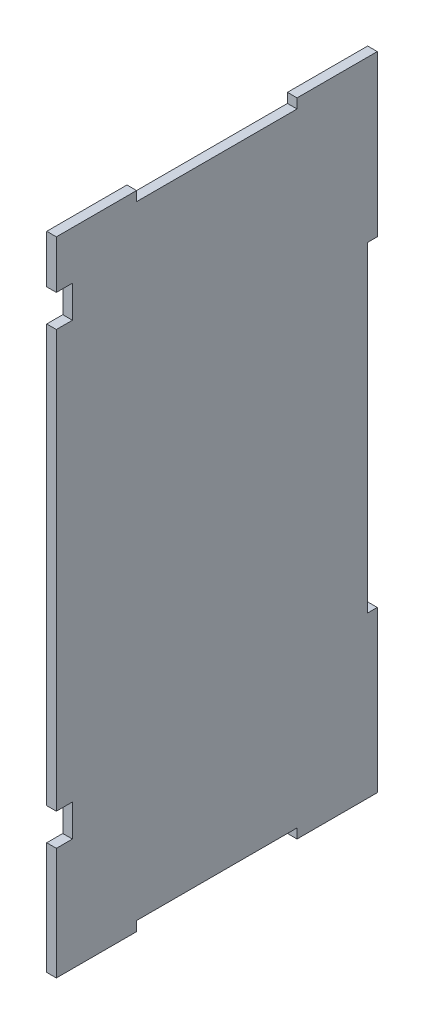
ISO-10303-21;
HEADER;
FILE_DESCRIPTION(('STEP AP214'),'2;1');
FILE_NAME('part.step','',(''),(''),'','','');
FILE_SCHEMA(('AUTOMOTIVE_DESIGN { 1 0 10303 214 1 1 1 1 }'));
ENDSEC;
DATA;
#1=APPLICATION_CONTEXT('core data for automotive mechanical design processes');
#2=APPLICATION_PROTOCOL_DEFINITION('international standard','automotive_design',2000,#1);
#3=PRODUCT_CONTEXT('',#1,'mechanical');
#4=PRODUCT('Part','Part','',(#3));
#5=PRODUCT_RELATED_PRODUCT_CATEGORY('part','',(#4));
#6=PRODUCT_DEFINITION_FORMATION('','',#4);
#7=PRODUCT_DEFINITION_CONTEXT('part definition',#1,'design');
#8=PRODUCT_DEFINITION('design','',#6,#7);
#9=PRODUCT_DEFINITION_SHAPE('','',#8);
#10=(LENGTH_UNIT() NAMED_UNIT(*) SI_UNIT(.MILLI.,.METRE.));
#11=(NAMED_UNIT(*) PLANE_ANGLE_UNIT() SI_UNIT($,.RADIAN.));
#12=(NAMED_UNIT(*) SI_UNIT($,.STERADIAN.) SOLID_ANGLE_UNIT());
#13=UNCERTAINTY_MEASURE_WITH_UNIT(LENGTH_MEASURE(1.E-05),#10,'distance_accuracy_value','');
#14=(GEOMETRIC_REPRESENTATION_CONTEXT(3) GLOBAL_UNCERTAINTY_ASSIGNED_CONTEXT((#13)) GLOBAL_UNIT_ASSIGNED_CONTEXT((#10,
#11,#12)) REPRESENTATION_CONTEXT('',''));
#15=CARTESIAN_POINT('',(0.,0.,0.));
#16=DIRECTION('',(0.,0.,1.));
#17=DIRECTION('',(1.,0.,0.));
#18=AXIS2_PLACEMENT_3D('',#15,#16,#17);
#19=CARTESIAN_POINT('',(-3.00000000000001,-105.653187342477,78.7678487614082));
#20=DIRECTION('',(0.,1.,0.));
#21=DIRECTION('',(0.,0.,1.));
#22=AXIS2_PLACEMENT_3D('',#19,#20,#21);
#23=PLANE('',#22);
#24=DIRECTION('',(0.,0.,1.));
#25=VECTOR('',#24,1.);
#26=CARTESIAN_POINT('',(0.,-105.653187342477,78.7678487614082));
#27=LINE('',#26,#25);
#28=CARTESIAN_POINT('',(0.,-105.653187342477,78.7678487614082));
#29=VERTEX_POINT('',#28);
#30=CARTESIAN_POINT('',(0.,-105.653187342477,103.767848761408));
#31=VERTEX_POINT('',#30);
#32=EDGE_CURVE('E214',#29,#31,#27,.T.);
#33=ORIENTED_EDGE('',*,*,#32,.T.);
#34=DIRECTION('',(1.,0.,0.));
#35=VECTOR('',#34,1.);
#36=CARTESIAN_POINT('',(-3.00000000000001,-105.653187342477,103.767848761408));
#37=LINE('',#36,#35);
#38=CARTESIAN_POINT('',(-3.00000000000001,-105.653187342477,103.767848761408));
#39=VERTEX_POINT('',#38);
#40=EDGE_CURVE('E10',#39,#31,#37,.T.);
#41=ORIENTED_EDGE('',*,*,#40,.F.);
#42=DIRECTION('',(0.,0.,1.));
#43=VECTOR('',#42,1.);
#44=CARTESIAN_POINT('',(-3.00000000000001,-105.653187342477,78.7678487614082));
#45=LINE('',#44,#43);
#46=CARTESIAN_POINT('',(-3.00000000000001,-105.653187342477,78.7678487614082));
#47=VERTEX_POINT('',#46);
#48=EDGE_CURVE('E208',#47,#39,#45,.T.);
#49=ORIENTED_EDGE('',*,*,#48,.F.);
#50=DIRECTION('',(1.,0.,0.));
#51=VECTOR('',#50,1.);
#52=CARTESIAN_POINT('',(-3.00000000000001,-105.653187342477,78.7678487614082));
#53=LINE('',#52,#51);
#54=EDGE_CURVE('E204',#47,#29,#53,.T.);
#55=ORIENTED_EDGE('',*,*,#54,.T.);
#56=EDGE_LOOP('',(#33,#41,#49,#55));
#57=FACE_BOUND('',#56,.T.);
#58=ADVANCED_FACE('F16',(#57),#23,.F.);
#59=CARTESIAN_POINT('',(-3.00000000000001,-105.653187342477,103.767848761408));
#60=DIRECTION('',(0.,0.,-1.));
#61=DIRECTION('',(-1.,0.,0.));
#62=AXIS2_PLACEMENT_3D('',#59,#60,#61);
#63=PLANE('',#62);
#64=DIRECTION('',(0.,1.,0.));
#65=VECTOR('',#64,1.);
#66=CARTESIAN_POINT('',(0.,-105.653187342477,103.767848761408));
#67=LINE('',#66,#65);
#68=CARTESIAN_POINT('',(0.,-70.6531873424773,103.767848761408));
#69=VERTEX_POINT('',#68);
#70=EDGE_CURVE('E210',#31,#69,#67,.T.);
#71=ORIENTED_EDGE('',*,*,#70,.T.);
#72=DIRECTION('',(1.,0.,0.));
#73=VECTOR('',#72,1.);
#74=CARTESIAN_POINT('',(-3.,-70.6531873424773,103.767848761408));
#75=LINE('',#74,#73);
#76=CARTESIAN_POINT('',(-3.,-70.6531873424773,103.767848761408));
#77=VERTEX_POINT('',#76);
#78=EDGE_CURVE('E24',#77,#69,#75,.T.);
#79=ORIENTED_EDGE('',*,*,#78,.F.);
#80=DIRECTION('',(0.,1.,0.));
#81=VECTOR('',#80,1.);
#82=CARTESIAN_POINT('',(-3.00000000000001,-105.653187342477,103.767848761408));
#83=LINE('',#82,#81);
#84=EDGE_CURVE('E123',#39,#77,#83,.T.);
#85=ORIENTED_EDGE('',*,*,#84,.F.);
#86=ORIENTED_EDGE('',*,*,#40,.T.);
#87=EDGE_LOOP('',(#71,#79,#85,#86));
#88=FACE_BOUND('',#87,.T.);
#89=ADVANCED_FACE('F418',(#88),#63,.F.);
#90=CARTESIAN_POINT('',(-3.,-70.6531873424773,103.767848761408));
#91=DIRECTION('',(0.,-1.,0.));
#92=DIRECTION('',(0.,0.,-1.));
#93=AXIS2_PLACEMENT_3D('',#90,#91,#92);
#94=PLANE('',#93);
#95=DIRECTION('',(0.,0.,-1.));
#96=VECTOR('',#95,1.);
#97=CARTESIAN_POINT('',(0.,-70.6531873424773,103.767848761408));
#98=LINE('',#97,#96);
#99=CARTESIAN_POINT('',(0.,-70.6531873424773,98.7678487614082));
#100=VERTEX_POINT('',#99);
#101=EDGE_CURVE('E213',#69,#100,#98,.T.);
#102=ORIENTED_EDGE('',*,*,#101,.T.);
#103=DIRECTION('',(1.,0.,0.));
#104=VECTOR('',#103,1.);
#105=CARTESIAN_POINT('',(-3.,-70.6531873424773,98.7678487614082));
#106=LINE('',#105,#104);
#107=CARTESIAN_POINT('',(-3.,-70.6531873424773,98.7678487614082));
#108=VERTEX_POINT('',#107);
#109=EDGE_CURVE('E334',#108,#100,#106,.T.);
#110=ORIENTED_EDGE('',*,*,#109,.F.);
#111=DIRECTION('',(0.,0.,-1.));
#112=VECTOR('',#111,1.);
#113=CARTESIAN_POINT('',(-3.,-70.6531873424773,103.767848761408));
#114=LINE('',#113,#112);
#115=EDGE_CURVE('E342',#77,#108,#114,.T.);
#116=ORIENTED_EDGE('',*,*,#115,.F.);
#117=ORIENTED_EDGE('',*,*,#78,.T.);
#118=EDGE_LOOP('',(#102,#110,#116,#117));
#119=FACE_BOUND('',#118,.T.);
#120=ADVANCED_FACE('F340',(#119),#94,.F.);
#121=CARTESIAN_POINT('',(-3.,-70.6531873424773,98.7678487614082));
#122=DIRECTION('',(0.,0.,-1.));
#123=DIRECTION('',(-1.,0.,0.));
#124=AXIS2_PLACEMENT_3D('',#121,#122,#123);
#125=PLANE('',#124);
#126=DIRECTION('',(0.,1.,0.));
#127=VECTOR('',#126,1.);
#128=CARTESIAN_POINT('',(0.,-70.6531873424773,98.7678487614082));
#129=LINE('',#128,#127);
#130=CARTESIAN_POINT('',(0.,-60.6531873424772,98.7678487614082));
#131=VERTEX_POINT('',#130);
#132=EDGE_CURVE('E217',#100,#131,#129,.T.);
#133=ORIENTED_EDGE('',*,*,#132,.T.);
#134=DIRECTION('',(1.,0.,0.));
#135=VECTOR('',#134,1.);
#136=CARTESIAN_POINT('',(-3.,-60.6531873424772,98.7678487614082));
#137=LINE('',#136,#135);
#138=CARTESIAN_POINT('',(-3.,-60.6531873424772,98.7678487614082));
#139=VERTEX_POINT('',#138);
#140=EDGE_CURVE('E331',#139,#131,#137,.T.);
#141=ORIENTED_EDGE('',*,*,#140,.F.);
#142=DIRECTION('',(0.,1.,0.));
#143=VECTOR('',#142,1.);
#144=CARTESIAN_POINT('',(-3.,-70.6531873424773,98.7678487614082));
#145=LINE('',#144,#143);
#146=EDGE_CURVE('E360',#108,#139,#145,.T.);
#147=ORIENTED_EDGE('',*,*,#146,.F.);
#148=ORIENTED_EDGE('',*,*,#109,.T.);
#149=EDGE_LOOP('',(#133,#141,#147,#148));
#150=FACE_BOUND('',#149,.T.);
#151=ADVANCED_FACE('F351',(#150),#125,.F.);
#152=CARTESIAN_POINT('',(-3.,-60.6531873424772,98.7678487614082));
#153=DIRECTION('',(0.,1.,0.));
#154=DIRECTION('',(0.,0.,1.));
#155=AXIS2_PLACEMENT_3D('',#152,#153,#154);
#156=PLANE('',#155);
#157=DIRECTION('',(0.,0.,1.));
#158=VECTOR('',#157,1.);
#159=CARTESIAN_POINT('',(0.,-60.6531873424772,98.7678487614082));
#160=LINE('',#159,#158);
#161=CARTESIAN_POINT('',(0.,-60.6531873424772,103.767848761408));
#162=VERTEX_POINT('',#161);
#163=EDGE_CURVE('E220',#131,#162,#160,.T.);
#164=ORIENTED_EDGE('',*,*,#163,.T.);
#165=DIRECTION('',(1.,0.,0.));
#166=VECTOR('',#165,1.);
#167=CARTESIAN_POINT('',(-3.,-60.6531873424772,103.767848761408));
#168=LINE('',#167,#166);
#169=CARTESIAN_POINT('',(-3.,-60.6531873424772,103.767848761408));
#170=VERTEX_POINT('',#169);
#171=EDGE_CURVE('E328',#170,#162,#168,.T.);
#172=ORIENTED_EDGE('',*,*,#171,.F.);
#173=DIRECTION('',(0.,0.,1.));
#174=VECTOR('',#173,1.);
#175=CARTESIAN_POINT('',(-3.,-60.6531873424772,98.7678487614082));
#176=LINE('',#175,#174);
#177=EDGE_CURVE('E357',#139,#170,#176,.T.);
#178=ORIENTED_EDGE('',*,*,#177,.F.);
#179=ORIENTED_EDGE('',*,*,#140,.T.);
#180=EDGE_LOOP('',(#164,#172,#178,#179));
#181=FACE_BOUND('',#180,.T.);
#182=ADVANCED_FACE('F355',(#181),#156,.F.);
#183=CARTESIAN_POINT('',(-3.,-60.6531873424772,103.767848761408));
#184=DIRECTION('',(0.,0.,-1.));
#185=DIRECTION('',(-1.,0.,0.));
#186=AXIS2_PLACEMENT_3D('',#183,#184,#185);
#187=PLANE('',#186);
#188=DIRECTION('',(0.,1.,0.));
#189=VECTOR('',#188,1.);
#190=CARTESIAN_POINT('',(0.,-60.6531873424772,103.767848761408));
#191=LINE('',#190,#189);
#192=CARTESIAN_POINT('',(0.,69.3468126575228,103.767848761408));
#193=VERTEX_POINT('',#192);
#194=EDGE_CURVE('E223',#162,#193,#191,.T.);
#195=ORIENTED_EDGE('',*,*,#194,.T.);
#196=DIRECTION('',(1.,0.,0.));
#197=VECTOR('',#196,1.);
#198=CARTESIAN_POINT('',(-3.,69.3468126575228,103.767848761408));
#199=LINE('',#198,#197);
#200=CARTESIAN_POINT('',(-3.,69.3468126575228,103.767848761408));
#201=VERTEX_POINT('',#200);
#202=EDGE_CURVE('E325',#201,#193,#199,.T.);
#203=ORIENTED_EDGE('',*,*,#202,.F.);
#204=DIRECTION('',(0.,1.,0.));
#205=VECTOR('',#204,1.);
#206=CARTESIAN_POINT('',(-3.,-60.6531873424772,103.767848761408));
#207=LINE('',#206,#205);
#208=EDGE_CURVE('E359',#170,#201,#207,.T.);
#209=ORIENTED_EDGE('',*,*,#208,.F.);
#210=ORIENTED_EDGE('',*,*,#171,.T.);
#211=EDGE_LOOP('',(#195,#203,#209,#210));
#212=FACE_BOUND('',#211,.T.);
#213=ADVANCED_FACE('F431',(#212),#187,.F.);
#214=CARTESIAN_POINT('',(-3.,69.3468126575228,103.767848761408));
#215=DIRECTION('',(0.,-1.,0.));
#216=DIRECTION('',(0.,0.,-1.));
#217=AXIS2_PLACEMENT_3D('',#214,#215,#216);
#218=PLANE('',#217);
#219=DIRECTION('',(0.,0.,-1.));
#220=VECTOR('',#219,1.);
#221=CARTESIAN_POINT('',(0.,69.3468126575228,103.767848761408));
#222=LINE('',#221,#220);
#223=CARTESIAN_POINT('',(0.,69.3468126575228,98.7678487614082));
#224=VERTEX_POINT('',#223);
#225=EDGE_CURVE('E226',#193,#224,#222,.T.);
#226=ORIENTED_EDGE('',*,*,#225,.T.);
#227=DIRECTION('',(1.,0.,0.));
#228=VECTOR('',#227,1.);
#229=CARTESIAN_POINT('',(-3.,69.3468126575228,98.7678487614082));
#230=LINE('',#229,#228);
#231=CARTESIAN_POINT('',(-3.,69.3468126575228,98.7678487614082));
#232=VERTEX_POINT('',#231);
#233=EDGE_CURVE('E322',#232,#224,#230,.T.);
#234=ORIENTED_EDGE('',*,*,#233,.F.);
#235=DIRECTION('',(0.,0.,-1.));
#236=VECTOR('',#235,1.);
#237=CARTESIAN_POINT('',(-3.,69.3468126575228,103.767848761408));
#238=LINE('',#237,#236);
#239=EDGE_CURVE('E362',#201,#232,#238,.T.);
#240=ORIENTED_EDGE('',*,*,#239,.F.);
#241=ORIENTED_EDGE('',*,*,#202,.T.);
#242=EDGE_LOOP('',(#226,#234,#240,#241));
#243=FACE_BOUND('',#242,.T.);
#244=ADVANCED_FACE('F434',(#243),#218,.F.);
#245=CARTESIAN_POINT('',(-3.,69.3468126575228,98.7678487614082));
#246=DIRECTION('',(0.,0.,-1.));
#247=DIRECTION('',(-1.,0.,0.));
#248=AXIS2_PLACEMENT_3D('',#245,#246,#247);
#249=PLANE('',#248);
#250=DIRECTION('',(0.,1.,0.));
#251=VECTOR('',#250,1.);
#252=CARTESIAN_POINT('',(0.,69.3468126575228,98.7678487614082));
#253=LINE('',#252,#251);
#254=CARTESIAN_POINT('',(0.,79.3468126575228,98.7678487614082));
#255=VERTEX_POINT('',#254);
#256=EDGE_CURVE('E229',#224,#255,#253,.T.);
#257=ORIENTED_EDGE('',*,*,#256,.T.);
#258=DIRECTION('',(1.,0.,0.));
#259=VECTOR('',#258,1.);
#260=CARTESIAN_POINT('',(-3.,79.3468126575228,98.7678487614082));
#261=LINE('',#260,#259);
#262=CARTESIAN_POINT('',(-3.,79.3468126575228,98.7678487614082));
#263=VERTEX_POINT('',#262);
#264=EDGE_CURVE('E319',#263,#255,#261,.T.);
#265=ORIENTED_EDGE('',*,*,#264,.F.);
#266=DIRECTION('',(0.,1.,0.));
#267=VECTOR('',#266,1.);
#268=CARTESIAN_POINT('',(-3.,69.3468126575228,98.7678487614082));
#269=LINE('',#268,#267);
#270=EDGE_CURVE('E368',#232,#263,#269,.T.);
#271=ORIENTED_EDGE('',*,*,#270,.F.);
#272=ORIENTED_EDGE('',*,*,#233,.T.);
#273=EDGE_LOOP('',(#257,#265,#271,#272));
#274=FACE_BOUND('',#273,.T.);
#275=ADVANCED_FACE('F438',(#274),#249,.F.);
#276=CARTESIAN_POINT('',(-3.,79.3468126575228,98.7678487614082));
#277=DIRECTION('',(0.,1.,0.));
#278=DIRECTION('',(0.,0.,1.));
#279=AXIS2_PLACEMENT_3D('',#276,#277,#278);
#280=PLANE('',#279);
#281=DIRECTION('',(0.,0.,1.));
#282=VECTOR('',#281,1.);
#283=CARTESIAN_POINT('',(0.,79.3468126575228,98.7678487614082));
#284=LINE('',#283,#282);
#285=CARTESIAN_POINT('',(0.,79.3468126575228,103.767848761408));
#286=VERTEX_POINT('',#285);
#287=EDGE_CURVE('E232',#255,#286,#284,.T.);
#288=ORIENTED_EDGE('',*,*,#287,.T.);
#289=DIRECTION('',(1.,0.,0.));
#290=VECTOR('',#289,1.);
#291=CARTESIAN_POINT('',(-3.,79.3468126575228,103.767848761408));
#292=LINE('',#291,#290);
#293=CARTESIAN_POINT('',(-3.,79.3468126575228,103.767848761408));
#294=VERTEX_POINT('',#293);
#295=EDGE_CURVE('E316',#294,#286,#292,.T.);
#296=ORIENTED_EDGE('',*,*,#295,.F.);
#297=DIRECTION('',(0.,0.,1.));
#298=VECTOR('',#297,1.);
#299=CARTESIAN_POINT('',(-3.,79.3468126575228,98.7678487614082));
#300=LINE('',#299,#298);
#301=EDGE_CURVE('E370',#263,#294,#300,.T.);
#302=ORIENTED_EDGE('',*,*,#301,.F.);
#303=ORIENTED_EDGE('',*,*,#264,.T.);
#304=EDGE_LOOP('',(#288,#296,#302,#303));
#305=FACE_BOUND('',#304,.T.);
#306=ADVANCED_FACE('F442',(#305),#280,.F.);
#307=CARTESIAN_POINT('',(-3.,79.3468126575228,103.767848761408));
#308=DIRECTION('',(0.,0.,-1.));
#309=DIRECTION('',(-1.,0.,0.));
#310=AXIS2_PLACEMENT_3D('',#307,#308,#309);
#311=PLANE('',#310);
#312=DIRECTION('',(0.,1.,0.));
#313=VECTOR('',#312,1.);
#314=CARTESIAN_POINT('',(0.,79.3468126575228,103.767848761408));
#315=LINE('',#314,#313);
#316=CARTESIAN_POINT('',(0.,94.3468126575228,103.767848761408));
#317=VERTEX_POINT('',#316);
#318=EDGE_CURVE('E235',#286,#317,#315,.T.);
#319=ORIENTED_EDGE('',*,*,#318,.T.);
#320=DIRECTION('',(1.,0.,0.));
#321=VECTOR('',#320,1.);
#322=CARTESIAN_POINT('',(-2.99999999999999,94.3468126575228,103.767848761408));
#323=LINE('',#322,#321);
#324=CARTESIAN_POINT('',(-2.99999999999999,94.3468126575228,103.767848761408));
#325=VERTEX_POINT('',#324);
#326=EDGE_CURVE('E313',#325,#317,#323,.T.);
#327=ORIENTED_EDGE('',*,*,#326,.F.);
#328=DIRECTION('',(0.,1.,0.));
#329=VECTOR('',#328,1.);
#330=CARTESIAN_POINT('',(-3.,79.3468126575228,103.767848761408));
#331=LINE('',#330,#329);
#332=EDGE_CURVE('E372',#294,#325,#331,.T.);
#333=ORIENTED_EDGE('',*,*,#332,.F.);
#334=ORIENTED_EDGE('',*,*,#295,.T.);
#335=EDGE_LOOP('',(#319,#327,#333,#334));
#336=FACE_BOUND('',#335,.T.);
#337=ADVANCED_FACE('F446',(#336),#311,.F.);
#338=CARTESIAN_POINT('',(-2.99999999999999,94.3468126575228,103.767848761408));
#339=DIRECTION('',(0.,-1.,0.));
#340=DIRECTION('',(0.,0.,-1.));
#341=AXIS2_PLACEMENT_3D('',#338,#339,#340);
#342=PLANE('',#341);
#343=DIRECTION('',(0.,0.,-1.));
#344=VECTOR('',#343,1.);
#345=CARTESIAN_POINT('',(0.,94.3468126575228,103.767848761408));
#346=LINE('',#345,#344);
#347=CARTESIAN_POINT('',(0.,94.3468126575228,78.7678487614082));
#348=VERTEX_POINT('',#347);
#349=EDGE_CURVE('E238',#317,#348,#346,.T.);
#350=ORIENTED_EDGE('',*,*,#349,.T.);
#351=DIRECTION('',(1.,0.,0.));
#352=VECTOR('',#351,1.);
#353=CARTESIAN_POINT('',(-2.99999999999999,94.3468126575228,78.7678487614082));
#354=LINE('',#353,#352);
#355=CARTESIAN_POINT('',(-2.99999999999999,94.3468126575228,78.7678487614082));
#356=VERTEX_POINT('',#355);
#357=EDGE_CURVE('E310',#356,#348,#354,.T.);
#358=ORIENTED_EDGE('',*,*,#357,.F.);
#359=DIRECTION('',(0.,0.,-1.));
#360=VECTOR('',#359,1.);
#361=CARTESIAN_POINT('',(-2.99999999999999,94.3468126575228,103.767848761408));
#362=LINE('',#361,#360);
#363=EDGE_CURVE('E374',#325,#356,#362,.T.);
#364=ORIENTED_EDGE('',*,*,#363,.F.);
#365=ORIENTED_EDGE('',*,*,#326,.T.);
#366=EDGE_LOOP('',(#350,#358,#364,#365));
#367=FACE_BOUND('',#366,.T.);
#368=ADVANCED_FACE('F450',(#367),#342,.F.);
#369=CARTESIAN_POINT('',(-2.99999999999999,94.3468126575228,78.7678487614082));
#370=DIRECTION('',(0.,0.,1.));
#371=DIRECTION('',(1.,0.,0.));
#372=AXIS2_PLACEMENT_3D('',#369,#370,#371);
#373=PLANE('',#372);
#374=DIRECTION('',(0.,-1.,0.));
#375=VECTOR('',#374,1.);
#376=CARTESIAN_POINT('',(0.,94.3468126575228,78.7678487614082));
#377=LINE('',#376,#375);
#378=CARTESIAN_POINT('',(0.,91.3468126575227,78.7678487614082));
#379=VERTEX_POINT('',#378);
#380=EDGE_CURVE('E241',#348,#379,#377,.T.);
#381=ORIENTED_EDGE('',*,*,#380,.T.);
#382=DIRECTION('',(1.,0.,0.));
#383=VECTOR('',#382,1.);
#384=CARTESIAN_POINT('',(-2.99999999999999,91.3468126575227,78.7678487614082));
#385=LINE('',#384,#383);
#386=CARTESIAN_POINT('',(-2.99999999999999,91.3468126575227,78.7678487614082));
#387=VERTEX_POINT('',#386);
#388=EDGE_CURVE('E307',#387,#379,#385,.T.);
#389=ORIENTED_EDGE('',*,*,#388,.F.);
#390=DIRECTION('',(0.,-1.,0.));
#391=VECTOR('',#390,1.);
#392=CARTESIAN_POINT('',(-2.99999999999999,94.3468126575228,78.7678487614082));
#393=LINE('',#392,#391);
#394=EDGE_CURVE('E376',#356,#387,#393,.T.);
#395=ORIENTED_EDGE('',*,*,#394,.F.);
#396=ORIENTED_EDGE('',*,*,#357,.T.);
#397=EDGE_LOOP('',(#381,#389,#395,#396));
#398=FACE_BOUND('',#397,.T.);
#399=ADVANCED_FACE('F454',(#398),#373,.F.);
#400=CARTESIAN_POINT('',(-2.99999999999999,91.3468126575227,78.7678487614082));
#401=DIRECTION('',(0.,-1.,0.));
#402=DIRECTION('',(0.,0.,-1.));
#403=AXIS2_PLACEMENT_3D('',#400,#401,#402);
#404=PLANE('',#403);
#405=DIRECTION('',(0.,0.,-1.));
#406=VECTOR('',#405,1.);
#407=CARTESIAN_POINT('',(0.,91.3468126575227,78.7678487614082));
#408=LINE('',#407,#406);
#409=CARTESIAN_POINT('',(0.,91.3468126575227,28.7678487614082));
#410=VERTEX_POINT('',#409);
#411=EDGE_CURVE('E244',#379,#410,#408,.T.);
#412=ORIENTED_EDGE('',*,*,#411,.T.);
#413=DIRECTION('',(1.,0.,0.));
#414=VECTOR('',#413,1.);
#415=CARTESIAN_POINT('',(-2.99999999999999,91.3468126575227,28.7678487614082));
#416=LINE('',#415,#414);
#417=CARTESIAN_POINT('',(-2.99999999999999,91.3468126575227,28.7678487614082));
#418=VERTEX_POINT('',#417);
#419=EDGE_CURVE('E304',#418,#410,#416,.T.);
#420=ORIENTED_EDGE('',*,*,#419,.F.);
#421=DIRECTION('',(0.,0.,-1.));
#422=VECTOR('',#421,1.);
#423=CARTESIAN_POINT('',(-2.99999999999999,91.3468126575227,78.7678487614082));
#424=LINE('',#423,#422);
#425=EDGE_CURVE('E378',#387,#418,#424,.T.);
#426=ORIENTED_EDGE('',*,*,#425,.F.);
#427=ORIENTED_EDGE('',*,*,#388,.T.);
#428=EDGE_LOOP('',(#412,#420,#426,#427));
#429=FACE_BOUND('',#428,.T.);
#430=ADVANCED_FACE('F458',(#429),#404,.F.);
#431=CARTESIAN_POINT('',(-2.99999999999999,91.3468126575227,28.7678487614082));
#432=DIRECTION('',(0.,0.,-1.));
#433=DIRECTION('',(-1.,0.,0.));
#434=AXIS2_PLACEMENT_3D('',#431,#432,#433);
#435=PLANE('',#434);
#436=DIRECTION('',(0.,1.,0.));
#437=VECTOR('',#436,1.);
#438=CARTESIAN_POINT('',(0.,91.3468126575227,28.7678487614082));
#439=LINE('',#438,#437);
#440=CARTESIAN_POINT('',(0.,94.3468126575228,28.7678487614082));
#441=VERTEX_POINT('',#440);
#442=EDGE_CURVE('E247',#410,#441,#439,.T.);
#443=ORIENTED_EDGE('',*,*,#442,.T.);
#444=DIRECTION('',(1.,0.,0.));
#445=VECTOR('',#444,1.);
#446=CARTESIAN_POINT('',(-2.99999999999999,94.3468126575228,28.7678487614082));
#447=LINE('',#446,#445);
#448=CARTESIAN_POINT('',(-2.99999999999999,94.3468126575228,28.7678487614082));
#449=VERTEX_POINT('',#448);
#450=EDGE_CURVE('E301',#449,#441,#447,.T.);
#451=ORIENTED_EDGE('',*,*,#450,.F.);
#452=DIRECTION('',(0.,1.,0.));
#453=VECTOR('',#452,1.);
#454=CARTESIAN_POINT('',(-2.99999999999999,91.3468126575227,28.7678487614082));
#455=LINE('',#454,#453);
#456=EDGE_CURVE('E380',#418,#449,#455,.T.);
#457=ORIENTED_EDGE('',*,*,#456,.F.);
#458=ORIENTED_EDGE('',*,*,#419,.T.);
#459=EDGE_LOOP('',(#443,#451,#457,#458));
#460=FACE_BOUND('',#459,.T.);
#461=ADVANCED_FACE('F462',(#460),#435,.F.);
#462=CARTESIAN_POINT('',(-2.99999999999999,94.3468126575228,28.7678487614082));
#463=DIRECTION('',(0.,-1.,0.));
#464=DIRECTION('',(0.,0.,-1.));
#465=AXIS2_PLACEMENT_3D('',#462,#463,#464);
#466=PLANE('',#465);
#467=DIRECTION('',(0.,0.,-1.));
#468=VECTOR('',#467,1.);
#469=CARTESIAN_POINT('',(0.,94.3468126575228,28.7678487614082));
#470=LINE('',#469,#468);
#471=CARTESIAN_POINT('',(0.,94.3468126575228,3.76784876140819));
#472=VERTEX_POINT('',#471);
#473=EDGE_CURVE('E250',#441,#472,#470,.T.);
#474=ORIENTED_EDGE('',*,*,#473,.T.);
#475=DIRECTION('',(1.,0.,0.));
#476=VECTOR('',#475,1.);
#477=CARTESIAN_POINT('',(-2.99999999999999,94.3468126575228,3.76784876140819));
#478=LINE('',#477,#476);
#479=CARTESIAN_POINT('',(-2.99999999999999,94.3468126575228,3.76784876140819));
#480=VERTEX_POINT('',#479);
#481=EDGE_CURVE('E298',#480,#472,#478,.T.);
#482=ORIENTED_EDGE('',*,*,#481,.F.);
#483=DIRECTION('',(0.,0.,-1.));
#484=VECTOR('',#483,1.);
#485=CARTESIAN_POINT('',(-2.99999999999999,94.3468126575228,28.7678487614082));
#486=LINE('',#485,#484);
#487=EDGE_CURVE('E382',#449,#480,#486,.T.);
#488=ORIENTED_EDGE('',*,*,#487,.F.);
#489=ORIENTED_EDGE('',*,*,#450,.T.);
#490=EDGE_LOOP('',(#474,#482,#488,#489));
#491=FACE_BOUND('',#490,.T.);
#492=ADVANCED_FACE('F466',(#491),#466,.F.);
#493=CARTESIAN_POINT('',(-2.99999999999999,94.3468126575228,3.76784876140819));
#494=DIRECTION('',(0.,0.,1.));
#495=DIRECTION('',(0.,-1.,0.));
#496=AXIS2_PLACEMENT_3D('',#493,#494,#495);
#497=PLANE('',#496);
#498=DIRECTION('',(0.,-1.,0.));
#499=VECTOR('',#498,1.);
#500=CARTESIAN_POINT('',(0.,94.3468126575228,3.76784876140819));
#501=LINE('',#500,#499);
#502=CARTESIAN_POINT('',(0.,44.3468126575228,3.76784876140819));
#503=VERTEX_POINT('',#502);
#504=EDGE_CURVE('E253',#472,#503,#501,.T.);
#505=ORIENTED_EDGE('',*,*,#504,.T.);
#506=DIRECTION('',(1.,0.,0.));
#507=VECTOR('',#506,1.);
#508=CARTESIAN_POINT('',(-3.,44.3468126575228,3.76784876140819));
#509=LINE('',#508,#507);
#510=CARTESIAN_POINT('',(-3.,44.3468126575228,3.76784876140819));
#511=VERTEX_POINT('',#510);
#512=EDGE_CURVE('E295',#511,#503,#509,.T.);
#513=ORIENTED_EDGE('',*,*,#512,.F.);
#514=DIRECTION('',(0.,-1.,0.));
#515=VECTOR('',#514,1.);
#516=CARTESIAN_POINT('',(-2.99999999999999,94.3468126575228,3.76784876140819));
#517=LINE('',#516,#515);
#518=EDGE_CURVE('E384',#480,#511,#517,.T.);
#519=ORIENTED_EDGE('',*,*,#518,.F.);
#520=ORIENTED_EDGE('',*,*,#481,.T.);
#521=EDGE_LOOP('',(#505,#513,#519,#520));
#522=FACE_BOUND('',#521,.T.);
#523=ADVANCED_FACE('F470',(#522),#497,.F.);
#524=CARTESIAN_POINT('',(-3.,44.3468126575228,3.76784876140819));
#525=DIRECTION('',(0.,1.,0.));
#526=DIRECTION('',(0.,0.,1.));
#527=AXIS2_PLACEMENT_3D('',#524,#525,#526);
#528=PLANE('',#527);
#529=DIRECTION('',(0.,0.,1.));
#530=VECTOR('',#529,1.);
#531=CARTESIAN_POINT('',(0.,44.3468126575228,3.76784876140819));
#532=LINE('',#531,#530);
#533=CARTESIAN_POINT('',(0.,44.3468126575228,6.7678487614082));
#534=VERTEX_POINT('',#533);
#535=EDGE_CURVE('E256',#503,#534,#532,.T.);
#536=ORIENTED_EDGE('',*,*,#535,.T.);
#537=DIRECTION('',(1.,0.,0.));
#538=VECTOR('',#537,1.);
#539=CARTESIAN_POINT('',(-3.,44.3468126575228,6.7678487614082));
#540=LINE('',#539,#538);
#541=CARTESIAN_POINT('',(-3.,44.3468126575228,6.7678487614082));
#542=VERTEX_POINT('',#541);
#543=EDGE_CURVE('E292',#542,#534,#540,.T.);
#544=ORIENTED_EDGE('',*,*,#543,.F.);
#545=DIRECTION('',(0.,0.,1.));
#546=VECTOR('',#545,1.);
#547=CARTESIAN_POINT('',(-3.,44.3468126575228,3.76784876140819));
#548=LINE('',#547,#546);
#549=EDGE_CURVE('E386',#511,#542,#548,.T.);
#550=ORIENTED_EDGE('',*,*,#549,.F.);
#551=ORIENTED_EDGE('',*,*,#512,.T.);
#552=EDGE_LOOP('',(#536,#544,#550,#551));
#553=FACE_BOUND('',#552,.T.);
#554=ADVANCED_FACE('F474',(#553),#528,.F.);
#555=CARTESIAN_POINT('',(-3.,44.3468126575228,6.7678487614082));
#556=DIRECTION('',(0.,0.,1.));
#557=DIRECTION('',(0.,-1.,0.));
#558=AXIS2_PLACEMENT_3D('',#555,#556,#557);
#559=PLANE('',#558);
#560=DIRECTION('',(0.,-1.,0.));
#561=VECTOR('',#560,1.);
#562=CARTESIAN_POINT('',(0.,44.3468126575228,6.7678487614082));
#563=LINE('',#562,#561);
#564=CARTESIAN_POINT('',(0.,-55.6531873424772,6.76784876140819));
#565=VERTEX_POINT('',#564);
#566=EDGE_CURVE('E259',#534,#565,#563,.T.);
#567=ORIENTED_EDGE('',*,*,#566,.T.);
#568=DIRECTION('',(1.,0.,0.));
#569=VECTOR('',#568,1.);
#570=CARTESIAN_POINT('',(-3.,-55.6531873424772,6.76784876140819));
#571=LINE('',#570,#569);
#572=CARTESIAN_POINT('',(-3.,-55.6531873424772,6.76784876140819));
#573=VERTEX_POINT('',#572);
#574=EDGE_CURVE('E289',#573,#565,#571,.T.);
#575=ORIENTED_EDGE('',*,*,#574,.F.);
#576=DIRECTION('',(0.,-1.,0.));
#577=VECTOR('',#576,1.);
#578=CARTESIAN_POINT('',(-3.,44.3468126575228,6.7678487614082));
#579=LINE('',#578,#577);
#580=EDGE_CURVE('E388',#542,#573,#579,.T.);
#581=ORIENTED_EDGE('',*,*,#580,.F.);
#582=ORIENTED_EDGE('',*,*,#543,.T.);
#583=EDGE_LOOP('',(#567,#575,#581,#582));
#584=FACE_BOUND('',#583,.T.);
#585=ADVANCED_FACE('F478',(#584),#559,.F.);
#586=CARTESIAN_POINT('',(-3.,-55.6531873424772,6.76784876140819));
#587=DIRECTION('',(0.,-1.,0.));
#588=DIRECTION('',(0.,0.,-1.));
#589=AXIS2_PLACEMENT_3D('',#586,#587,#588);
#590=PLANE('',#589);
#591=DIRECTION('',(0.,0.,-1.));
#592=VECTOR('',#591,1.);
#593=CARTESIAN_POINT('',(0.,-55.6531873424772,6.76784876140819));
#594=LINE('',#593,#592);
#595=CARTESIAN_POINT('',(0.,-55.6531873424772,3.76784876140819));
#596=VERTEX_POINT('',#595);
#597=EDGE_CURVE('E262',#565,#596,#594,.T.);
#598=ORIENTED_EDGE('',*,*,#597,.T.);
#599=DIRECTION('',(1.,0.,0.));
#600=VECTOR('',#599,1.);
#601=CARTESIAN_POINT('',(-3.,-55.6531873424772,3.76784876140819));
#602=LINE('',#601,#600);
#603=CARTESIAN_POINT('',(-3.,-55.6531873424772,3.76784876140819));
#604=VERTEX_POINT('',#603);
#605=EDGE_CURVE('E286',#604,#596,#602,.T.);
#606=ORIENTED_EDGE('',*,*,#605,.F.);
#607=DIRECTION('',(0.,0.,-1.));
#608=VECTOR('',#607,1.);
#609=CARTESIAN_POINT('',(-3.,-55.6531873424772,6.76784876140819));
#610=LINE('',#609,#608);
#611=EDGE_CURVE('E390',#573,#604,#610,.T.);
#612=ORIENTED_EDGE('',*,*,#611,.F.);
#613=ORIENTED_EDGE('',*,*,#574,.T.);
#614=EDGE_LOOP('',(#598,#606,#612,#613));
#615=FACE_BOUND('',#614,.T.);
#616=ADVANCED_FACE('F482',(#615),#590,.F.);
#617=CARTESIAN_POINT('',(-3.,-55.6531873424772,3.76784876140819));
#618=DIRECTION('',(0.,0.,1.));
#619=DIRECTION('',(1.,0.,0.));
#620=AXIS2_PLACEMENT_3D('',#617,#618,#619);
#621=PLANE('',#620);
#622=DIRECTION('',(0.,-1.,0.));
#623=VECTOR('',#622,1.);
#624=CARTESIAN_POINT('',(0.,-55.6531873424772,3.76784876140819));
#625=LINE('',#624,#623);
#626=CARTESIAN_POINT('',(0.,-105.653187342477,3.76784876140819));
#627=VERTEX_POINT('',#626);
#628=EDGE_CURVE('E265',#596,#627,#625,.T.);
#629=ORIENTED_EDGE('',*,*,#628,.T.);
#630=DIRECTION('',(1.,0.,0.));
#631=VECTOR('',#630,1.);
#632=CARTESIAN_POINT('',(-3.00000000000001,-105.653187342477,3.76784876140819));
#633=LINE('',#632,#631);
#634=CARTESIAN_POINT('',(-3.00000000000001,-105.653187342477,3.76784876140819));
#635=VERTEX_POINT('',#634);
#636=EDGE_CURVE('E283',#635,#627,#633,.T.);
#637=ORIENTED_EDGE('',*,*,#636,.F.);
#638=DIRECTION('',(0.,-1.,0.));
#639=VECTOR('',#638,1.);
#640=CARTESIAN_POINT('',(-3.,-55.6531873424772,3.76784876140819));
#641=LINE('',#640,#639);
#642=EDGE_CURVE('E392',#604,#635,#641,.T.);
#643=ORIENTED_EDGE('',*,*,#642,.F.);
#644=ORIENTED_EDGE('',*,*,#605,.T.);
#645=EDGE_LOOP('',(#629,#637,#643,#644));
#646=FACE_BOUND('',#645,.T.);
#647=ADVANCED_FACE('F398',(#646),#621,.F.);
#648=CARTESIAN_POINT('',(-3.00000000000001,-105.653187342477,3.76784876140819));
#649=DIRECTION('',(0.,1.,0.));
#650=DIRECTION('',(0.,0.,1.));
#651=AXIS2_PLACEMENT_3D('',#648,#649,#650);
#652=PLANE('',#651);
#653=DIRECTION('',(0.,0.,1.));
#654=VECTOR('',#653,1.);
#655=CARTESIAN_POINT('',(0.,-105.653187342477,3.76784876140819));
#656=LINE('',#655,#654);
#657=CARTESIAN_POINT('',(0.,-105.653187342477,28.7678487614082));
#658=VERTEX_POINT('',#657);
#659=EDGE_CURVE('E268',#627,#658,#656,.T.);
#660=ORIENTED_EDGE('',*,*,#659,.T.);
#661=DIRECTION('',(1.,0.,0.));
#662=VECTOR('',#661,1.);
#663=CARTESIAN_POINT('',(-3.00000000000001,-105.653187342477,28.7678487614082));
#664=LINE('',#663,#662);
#665=CARTESIAN_POINT('',(-3.00000000000001,-105.653187342477,28.7678487614082));
#666=VERTEX_POINT('',#665);
#667=EDGE_CURVE('E199',#666,#658,#664,.T.);
#668=ORIENTED_EDGE('',*,*,#667,.F.);
#669=DIRECTION('',(0.,0.,1.));
#670=VECTOR('',#669,1.);
#671=CARTESIAN_POINT('',(-3.00000000000001,-105.653187342477,3.76784876140819));
#672=LINE('',#671,#670);
#673=EDGE_CURVE('E190',#635,#666,#672,.T.);
#674=ORIENTED_EDGE('',*,*,#673,.F.);
#675=ORIENTED_EDGE('',*,*,#636,.T.);
#676=EDGE_LOOP('',(#660,#668,#674,#675));
#677=FACE_BOUND('',#676,.T.);
#678=ADVANCED_FACE('F402',(#677),#652,.F.);
#679=CARTESIAN_POINT('',(-3.00000000000001,-105.653187342477,28.7678487614082));
#680=DIRECTION('',(0.,0.,-1.));
#681=DIRECTION('',(-1.,0.,0.));
#682=AXIS2_PLACEMENT_3D('',#679,#680,#681);
#683=PLANE('',#682);
#684=DIRECTION('',(0.,1.,0.));
#685=VECTOR('',#684,1.);
#686=CARTESIAN_POINT('',(0.,-105.653187342477,28.7678487614082));
#687=LINE('',#686,#685);
#688=CARTESIAN_POINT('',(0.,-102.653187342477,28.7678487614082));
#689=VERTEX_POINT('',#688);
#690=EDGE_CURVE('E198',#658,#689,#687,.T.);
#691=ORIENTED_EDGE('',*,*,#690,.T.);
#692=DIRECTION('',(1.,0.,0.));
#693=VECTOR('',#692,1.);
#694=CARTESIAN_POINT('',(-3.00000000000001,-102.653187342477,28.7678487614082));
#695=LINE('',#694,#693);
#696=CARTESIAN_POINT('',(-3.00000000000001,-102.653187342477,28.7678487614082));
#697=VERTEX_POINT('',#696);
#698=EDGE_CURVE('E195',#697,#689,#695,.T.);
#699=ORIENTED_EDGE('',*,*,#698,.F.);
#700=DIRECTION('',(0.,1.,0.));
#701=VECTOR('',#700,1.);
#702=CARTESIAN_POINT('',(-3.00000000000001,-105.653187342477,28.7678487614082));
#703=LINE('',#702,#701);
#704=EDGE_CURVE('E184',#666,#697,#703,.T.);
#705=ORIENTED_EDGE('',*,*,#704,.F.);
#706=ORIENTED_EDGE('',*,*,#667,.T.);
#707=EDGE_LOOP('',(#691,#699,#705,#706));
#708=FACE_BOUND('',#707,.T.);
#709=ADVANCED_FACE('F196',(#708),#683,.F.);
#710=CARTESIAN_POINT('',(-3.00000000000001,-102.653187342477,28.7678487614082));
#711=DIRECTION('',(0.,1.,0.));
#712=DIRECTION('',(0.,0.,1.));
#713=AXIS2_PLACEMENT_3D('',#710,#711,#712);
#714=PLANE('',#713);
#715=DIRECTION('',(0.,0.,1.));
#716=VECTOR('',#715,1.);
#717=CARTESIAN_POINT('',(0.,-102.653187342477,28.7678487614082));
#718=LINE('',#717,#716);
#719=CARTESIAN_POINT('',(0.,-102.653187342477,78.7678487614082));
#720=VERTEX_POINT('',#719);
#721=EDGE_CURVE('E109',#689,#720,#718,.T.);
#722=ORIENTED_EDGE('',*,*,#721,.T.);
#723=DIRECTION('',(1.,0.,0.));
#724=VECTOR('',#723,1.);
#725=CARTESIAN_POINT('',(-3.00000000000001,-102.653187342477,78.7678487614082));
#726=LINE('',#725,#724);
#727=CARTESIAN_POINT('',(-3.00000000000001,-102.653187342477,78.7678487614082));
#728=VERTEX_POINT('',#727);
#729=EDGE_CURVE('E200',#728,#720,#726,.T.);
#730=ORIENTED_EDGE('',*,*,#729,.F.);
#731=DIRECTION('',(0.,0.,1.));
#732=VECTOR('',#731,1.);
#733=CARTESIAN_POINT('',(-3.00000000000001,-102.653187342477,28.7678487614082));
#734=LINE('',#733,#732);
#735=EDGE_CURVE('E188',#697,#728,#734,.T.);
#736=ORIENTED_EDGE('',*,*,#735,.F.);
#737=ORIENTED_EDGE('',*,*,#698,.T.);
#738=EDGE_LOOP('',(#722,#730,#736,#737));
#739=FACE_BOUND('',#738,.T.);
#740=ADVANCED_FACE('F202',(#739),#714,.F.);
#741=CARTESIAN_POINT('',(-3.00000000000001,-102.653187342477,78.7678487614082));
#742=DIRECTION('',(0.,0.,1.));
#743=DIRECTION('',(1.,0.,0.));
#744=AXIS2_PLACEMENT_3D('',#741,#742,#743);
#745=PLANE('',#744);
#746=DIRECTION('',(0.,-1.,0.));
#747=VECTOR('',#746,1.);
#748=CARTESIAN_POINT('',(0.,-102.653187342477,78.7678487614082));
#749=LINE('',#748,#747);
#750=EDGE_CURVE('E115',#720,#29,#749,.T.);
#751=ORIENTED_EDGE('',*,*,#750,.T.);
#752=ORIENTED_EDGE('',*,*,#54,.F.);
#753=DIRECTION('',(0.,-1.,0.));
#754=VECTOR('',#753,1.);
#755=CARTESIAN_POINT('',(-3.00000000000001,-102.653187342477,78.7678487614082));
#756=LINE('',#755,#754);
#757=EDGE_CURVE('E32',#728,#47,#756,.T.);
#758=ORIENTED_EDGE('',*,*,#757,.F.);
#759=ORIENTED_EDGE('',*,*,#729,.T.);
#760=EDGE_LOOP('',(#751,#752,#758,#759));
#761=FACE_BOUND('',#760,.T.);
#762=ADVANCED_FACE('F406',(#761),#745,.F.);
#763=CARTESIAN_POINT('',(-3.,0.,0.));
#764=DIRECTION('',(-1.,0.,0.));
#765=DIRECTION('',(0.,-1.,0.));
#766=AXIS2_PLACEMENT_3D('',#763,#764,#765);
#767=PLANE('',#766);
#768=ORIENTED_EDGE('',*,*,#48,.T.);
#769=ORIENTED_EDGE('',*,*,#84,.T.);
#770=ORIENTED_EDGE('',*,*,#115,.T.);
#771=ORIENTED_EDGE('',*,*,#146,.T.);
#772=ORIENTED_EDGE('',*,*,#177,.T.);
#773=ORIENTED_EDGE('',*,*,#208,.T.);
#774=ORIENTED_EDGE('',*,*,#239,.T.);
#775=ORIENTED_EDGE('',*,*,#270,.T.);
#776=ORIENTED_EDGE('',*,*,#301,.T.);
#777=ORIENTED_EDGE('',*,*,#332,.T.);
#778=ORIENTED_EDGE('',*,*,#363,.T.);
#779=ORIENTED_EDGE('',*,*,#394,.T.);
#780=ORIENTED_EDGE('',*,*,#425,.T.);
#781=ORIENTED_EDGE('',*,*,#456,.T.);
#782=ORIENTED_EDGE('',*,*,#487,.T.);
#783=ORIENTED_EDGE('',*,*,#518,.T.);
#784=ORIENTED_EDGE('',*,*,#549,.T.);
#785=ORIENTED_EDGE('',*,*,#580,.T.);
#786=ORIENTED_EDGE('',*,*,#611,.T.);
#787=ORIENTED_EDGE('',*,*,#642,.T.);
#788=ORIENTED_EDGE('',*,*,#673,.T.);
#789=ORIENTED_EDGE('',*,*,#704,.T.);
#790=ORIENTED_EDGE('',*,*,#735,.T.);
#791=ORIENTED_EDGE('',*,*,#757,.T.);
#792=EDGE_LOOP('',(#768,#769,#770,#771,#772,#773,#774,#775,#776,#777,#778,#779,#780,#781,#782,
#783,#784,#785,#786,#787,#788,#789,#790,#791));
#793=FACE_BOUND('',#792,.T.);
#794=ADVANCED_FACE('F186',(#793),#767,.T.);
#795=CARTESIAN_POINT('',(0.,0.,0.));
#796=DIRECTION('',(-1.,0.,0.));
#797=DIRECTION('',(0.,-1.,0.));
#798=AXIS2_PLACEMENT_3D('',#795,#796,#797);
#799=PLANE('',#798);
#800=ORIENTED_EDGE('',*,*,#32,.F.);
#801=ORIENTED_EDGE('',*,*,#750,.F.);
#802=ORIENTED_EDGE('',*,*,#721,.F.);
#803=ORIENTED_EDGE('',*,*,#690,.F.);
#804=ORIENTED_EDGE('',*,*,#659,.F.);
#805=ORIENTED_EDGE('',*,*,#628,.F.);
#806=ORIENTED_EDGE('',*,*,#597,.F.);
#807=ORIENTED_EDGE('',*,*,#566,.F.);
#808=ORIENTED_EDGE('',*,*,#535,.F.);
#809=ORIENTED_EDGE('',*,*,#504,.F.);
#810=ORIENTED_EDGE('',*,*,#473,.F.);
#811=ORIENTED_EDGE('',*,*,#442,.F.);
#812=ORIENTED_EDGE('',*,*,#411,.F.);
#813=ORIENTED_EDGE('',*,*,#380,.F.);
#814=ORIENTED_EDGE('',*,*,#349,.F.);
#815=ORIENTED_EDGE('',*,*,#318,.F.);
#816=ORIENTED_EDGE('',*,*,#287,.F.);
#817=ORIENTED_EDGE('',*,*,#256,.F.);
#818=ORIENTED_EDGE('',*,*,#225,.F.);
#819=ORIENTED_EDGE('',*,*,#194,.F.);
#820=ORIENTED_EDGE('',*,*,#163,.F.);
#821=ORIENTED_EDGE('',*,*,#132,.F.);
#822=ORIENTED_EDGE('',*,*,#101,.F.);
#823=ORIENTED_EDGE('',*,*,#70,.F.);
#824=EDGE_LOOP('',(#800,#801,#802,#803,#804,#805,#806,#807,#808,#809,#810,#811,#812,#813,#814,
#815,#816,#817,#818,#819,#820,#821,#822,#823));
#825=FACE_BOUND('',#824,.T.);
#826=ADVANCED_FACE('F346',(#825),#799,.F.);
#827=CLOSED_SHELL('',(#58,#89,#120,#151,#182,#213,#244,#275,#306,#337,#368,#399,#430,#461,#492,
#523,#554,#585,#616,#647,#678,#709,#740,#762,#794,#826));
#828=MANIFOLD_SOLID_BREP('B1',#827);
#829=ADVANCED_BREP_SHAPE_REPRESENTATION('',(#18,#828),#14);
#830=SHAPE_DEFINITION_REPRESENTATION(#9,#829);
ENDSEC;
END-ISO-10303-21;
